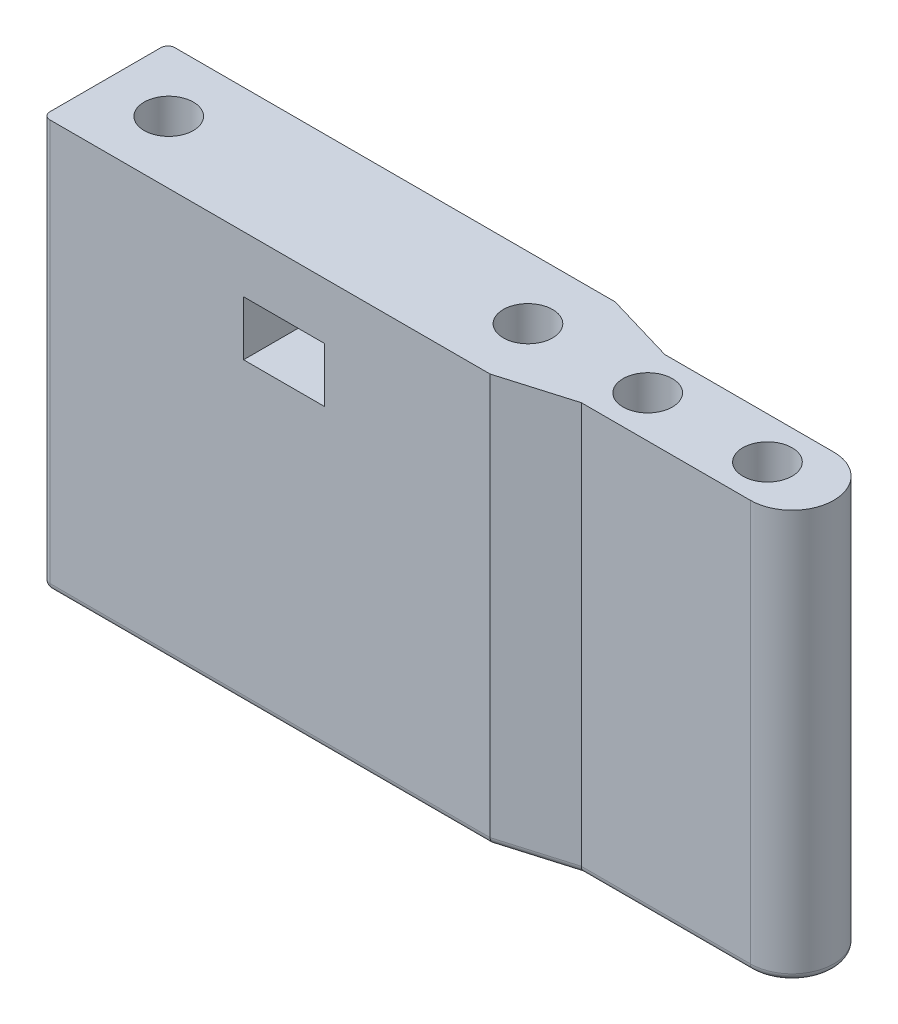
ISO-10303-21;
HEADER;
FILE_DESCRIPTION(('STEP AP214'),'2;1');
FILE_NAME('part.step','',(''),(''),'','','');
FILE_SCHEMA(('AUTOMOTIVE_DESIGN { 1 0 10303 214 1 1 1 1 }'));
ENDSEC;
DATA;
#1=APPLICATION_CONTEXT('core data for automotive mechanical design processes');
#2=APPLICATION_PROTOCOL_DEFINITION('international standard','automotive_design',2000,#1);
#3=PRODUCT_CONTEXT('',#1,'mechanical');
#4=PRODUCT('Part','Part','',(#3));
#5=PRODUCT_RELATED_PRODUCT_CATEGORY('part','',(#4));
#6=PRODUCT_DEFINITION_FORMATION('','',#4);
#7=PRODUCT_DEFINITION_CONTEXT('part definition',#1,'design');
#8=PRODUCT_DEFINITION('design','',#6,#7);
#9=PRODUCT_DEFINITION_SHAPE('','',#8);
#10=(LENGTH_UNIT() NAMED_UNIT(*) SI_UNIT(.MILLI.,.METRE.));
#11=(NAMED_UNIT(*) PLANE_ANGLE_UNIT() SI_UNIT($,.RADIAN.));
#12=(NAMED_UNIT(*) SI_UNIT($,.STERADIAN.) SOLID_ANGLE_UNIT());
#13=UNCERTAINTY_MEASURE_WITH_UNIT(LENGTH_MEASURE(1.E-05),#10,'distance_accuracy_value','');
#14=(GEOMETRIC_REPRESENTATION_CONTEXT(3) GLOBAL_UNCERTAINTY_ASSIGNED_CONTEXT((#13)) GLOBAL_UNIT_ASSIGNED_CONTEXT((#10,
#11,#12)) REPRESENTATION_CONTEXT('',''));
#15=CARTESIAN_POINT('',(0.,0.,0.));
#16=DIRECTION('',(0.,0.,1.));
#17=DIRECTION('',(1.,0.,0.));
#18=AXIS2_PLACEMENT_3D('',#15,#16,#17);
#19=CARTESIAN_POINT('',(0.,0.,17.75));
#20=DIRECTION('',(0.,0.,1.));
#21=DIRECTION('',(1.,0.,0.));
#22=AXIS2_PLACEMENT_3D('',#19,#20,#21);
#23=PLANE('',#22);
#24=DIRECTION('',(-1.,0.,0.));
#25=VECTOR('',#24,1.);
#26=CARTESIAN_POINT('',(-87.4648511856686,42.1547619047619,17.75));
#27=LINE('',#26,#25);
#28=CARTESIAN_POINT('',(-23.9648511856685,42.1547619047619,17.75));
#29=VERTEX_POINT('',#28);
#30=CARTESIAN_POINT('',(-86.4648511856686,42.1547619047619,17.75));
#31=VERTEX_POINT('',#30);
#32=EDGE_CURVE('E181',#29,#31,#27,.T.);
#33=ORIENTED_EDGE('',*,*,#32,.T.);
#34=DIRECTION('',(0.,-1.,0.));
#35=VECTOR('',#34,1.);
#36=CARTESIAN_POINT('',(-86.4648511856686,-14.8452380952381,17.75));
#37=LINE('',#36,#35);
#38=CARTESIAN_POINT('',(-86.4648511856686,-14.8452380952381,17.75));
#39=VERTEX_POINT('',#38);
#40=EDGE_CURVE('E262',#31,#39,#37,.T.);
#41=ORIENTED_EDGE('',*,*,#40,.T.);
#42=DIRECTION('',(1.,0.,0.));
#43=VECTOR('',#42,1.);
#44=CARTESIAN_POINT('',(-23.9648511856685,-14.8452380952381,17.75));
#45=LINE('',#44,#43);
#46=CARTESIAN_POINT('',(-23.9648511856685,-14.8452380952381,17.75));
#47=VERTEX_POINT('',#46);
#48=EDGE_CURVE('E184',#39,#47,#45,.T.);
#49=ORIENTED_EDGE('',*,*,#48,.T.);
#50=DIRECTION('',(0.,-1.,0.));
#51=VECTOR('',#50,1.);
#52=CARTESIAN_POINT('',(-23.9648511856685,42.1547619047619,17.75));
#53=LINE('',#52,#51);
#54=EDGE_CURVE('E169',#29,#47,#53,.T.);
#55=ORIENTED_EDGE('',*,*,#54,.F.);
#56=EDGE_LOOP('',(#33,#41,#49,#55));
#57=FACE_BOUND('',#56,.T.);
#58=DIRECTION('',(1.,0.,0.));
#59=VECTOR('',#58,1.);
#60=CARTESIAN_POINT('',(-58.9648511856686,26.4047619047619,17.75));
#61=LINE('',#60,#59);
#62=CARTESIAN_POINT('',(-58.9648511856686,26.4047619047619,17.75));
#63=VERTEX_POINT('',#62);
#64=CARTESIAN_POINT('',(-47.4648511856686,26.4047619047619,17.75));
#65=VERTEX_POINT('',#64);
#66=EDGE_CURVE('E336',#63,#65,#61,.T.);
#67=ORIENTED_EDGE('',*,*,#66,.F.);
#68=DIRECTION('',(0.,-1.,0.));
#69=VECTOR('',#68,1.);
#70=CARTESIAN_POINT('',(-58.9648511856686,34.1547619047619,17.75));
#71=LINE('',#70,#69);
#72=CARTESIAN_POINT('',(-58.9648511856686,34.1547619047619,17.75));
#73=VERTEX_POINT('',#72);
#74=EDGE_CURVE('E334',#73,#63,#71,.T.);
#75=ORIENTED_EDGE('',*,*,#74,.F.);
#76=DIRECTION('',(-1.,0.,0.));
#77=VECTOR('',#76,1.);
#78=CARTESIAN_POINT('',(-58.9648511856686,34.1547619047619,17.75));
#79=LINE('',#78,#77);
#80=CARTESIAN_POINT('',(-47.4648511856686,34.1547619047619,17.75));
#81=VERTEX_POINT('',#80);
#82=EDGE_CURVE('E342',#81,#73,#79,.T.);
#83=ORIENTED_EDGE('',*,*,#82,.F.);
#84=DIRECTION('',(0.,1.,0.));
#85=VECTOR('',#84,1.);
#86=CARTESIAN_POINT('',(-47.4648511856686,34.1547619047619,17.75));
#87=LINE('',#86,#85);
#88=EDGE_CURVE('E339',#65,#81,#87,.T.);
#89=ORIENTED_EDGE('',*,*,#88,.F.);
#90=EDGE_LOOP('',(#67,#75,#83,#89));
#91=FACE_BOUND('',#90,.T.);
#92=ADVANCED_FACE('F37',(#57,#91),#23,.T.);
#93=CARTESIAN_POINT('',(0.,0.,0.));
#94=DIRECTION('',(0.,0.,1.));
#95=DIRECTION('',(1.,0.,0.));
#96=AXIS2_PLACEMENT_3D('',#93,#94,#95);
#97=PLANE('',#96);
#98=DIRECTION('',(1.,0.,0.));
#99=VECTOR('',#98,1.);
#100=CARTESIAN_POINT('',(0.,-14.8452380952381,0.));
#101=LINE('',#100,#99);
#102=CARTESIAN_POINT('',(-23.9648511856685,-14.8452380952381,0.));
#103=VERTEX_POINT('',#102);
#104=CARTESIAN_POINT('',(-86.4648511856686,-14.8452380952381,0.));
#105=VERTEX_POINT('',#104);
#106=EDGE_CURVE('E230',#103,#105,#101,.F.);
#107=ORIENTED_EDGE('',*,*,#106,.T.);
#108=DIRECTION('',(0.,-1.,0.));
#109=VECTOR('',#108,1.);
#110=CARTESIAN_POINT('',(-86.4648511856686,0.,0.));
#111=LINE('',#110,#109);
#112=CARTESIAN_POINT('',(-86.4648511856686,42.1547619047619,0.));
#113=VERTEX_POINT('',#112);
#114=EDGE_CURVE('E11',#105,#113,#111,.F.);
#115=ORIENTED_EDGE('',*,*,#114,.T.);
#116=DIRECTION('',(-1.,0.,0.));
#117=VECTOR('',#116,1.);
#118=CARTESIAN_POINT('',(-87.4648511856686,42.1547619047619,0.));
#119=LINE('',#118,#117);
#120=CARTESIAN_POINT('',(-23.9648511856685,42.1547619047619,0.));
#121=VERTEX_POINT('',#120);
#122=EDGE_CURVE('E190',#121,#113,#119,.T.);
#123=ORIENTED_EDGE('',*,*,#122,.F.);
#124=DIRECTION('',(0.,-1.,0.));
#125=VECTOR('',#124,1.);
#126=CARTESIAN_POINT('',(-23.9648511856685,42.1547619047619,0.));
#127=LINE('',#126,#125);
#128=EDGE_CURVE('E329',#121,#103,#127,.T.);
#129=ORIENTED_EDGE('',*,*,#128,.T.);
#130=EDGE_LOOP('',(#107,#115,#123,#129));
#131=FACE_BOUND('',#130,.T.);
#132=DIRECTION('',(0.,-1.,0.));
#133=VECTOR('',#132,1.);
#134=CARTESIAN_POINT('',(-58.9648511856686,34.1547619047619,0.));
#135=LINE('',#134,#133);
#136=CARTESIAN_POINT('',(-58.9648511856686,34.1547619047619,0.));
#137=VERTEX_POINT('',#136);
#138=CARTESIAN_POINT('',(-58.9648511856686,26.4047619047619,0.));
#139=VERTEX_POINT('',#138);
#140=EDGE_CURVE('E345',#137,#139,#135,.T.);
#141=ORIENTED_EDGE('',*,*,#140,.T.);
#142=DIRECTION('',(1.,0.,0.));
#143=VECTOR('',#142,1.);
#144=CARTESIAN_POINT('',(-58.9648511856686,26.4047619047619,0.));
#145=LINE('',#144,#143);
#146=CARTESIAN_POINT('',(-47.4648511856686,26.4047619047619,0.));
#147=VERTEX_POINT('',#146);
#148=EDGE_CURVE('E348',#139,#147,#145,.T.);
#149=ORIENTED_EDGE('',*,*,#148,.T.);
#150=DIRECTION('',(0.,1.,0.));
#151=VECTOR('',#150,1.);
#152=CARTESIAN_POINT('',(-47.4648511856686,34.1547619047619,0.));
#153=LINE('',#152,#151);
#154=CARTESIAN_POINT('',(-47.4648511856686,34.1547619047619,0.));
#155=VERTEX_POINT('',#154);
#156=EDGE_CURVE('E351',#147,#155,#153,.T.);
#157=ORIENTED_EDGE('',*,*,#156,.T.);
#158=DIRECTION('',(-1.,0.,0.));
#159=VECTOR('',#158,1.);
#160=CARTESIAN_POINT('',(-58.9648511856686,34.1547619047619,0.));
#161=LINE('',#160,#159);
#162=EDGE_CURVE('E337',#155,#137,#161,.T.);
#163=ORIENTED_EDGE('',*,*,#162,.T.);
#164=EDGE_LOOP('',(#141,#149,#157,#163));
#165=FACE_BOUND('',#164,.T.);
#166=ADVANCED_FACE('F371',(#131,#165),#97,.F.);
#167=CARTESIAN_POINT('',(-87.4648511856686,42.1547619047619,17.75));
#168=DIRECTION('',(1.,0.,0.));
#169=DIRECTION('',(0.,0.,-1.));
#170=AXIS2_PLACEMENT_3D('',#167,#168,#169);
#171=PLANE('',#170);
#172=DIRECTION('',(0.,0.,-1.));
#173=VECTOR('',#172,1.);
#174=CARTESIAN_POINT('',(-87.4648511856686,-14.8452380952381,17.75));
#175=LINE('',#174,#173);
#176=CARTESIAN_POINT('',(-87.4648511856686,-14.8452380952381,1.));
#177=VERTEX_POINT('',#176);
#178=CARTESIAN_POINT('',(-87.4648511856686,-14.8452380952381,16.75));
#179=VERTEX_POINT('',#178);
#180=EDGE_CURVE('E216',#177,#179,#175,.F.);
#181=ORIENTED_EDGE('',*,*,#180,.T.);
#182=DIRECTION('',(0.,-1.,0.));
#183=VECTOR('',#182,1.);
#184=CARTESIAN_POINT('',(-87.4648511856686,42.1547619047619,16.75));
#185=LINE('',#184,#183);
#186=CARTESIAN_POINT('',(-87.4648511856686,42.1547619047619,16.75));
#187=VERTEX_POINT('',#186);
#188=EDGE_CURVE('E266',#179,#187,#185,.F.);
#189=ORIENTED_EDGE('',*,*,#188,.T.);
#190=DIRECTION('',(0.,0.,-1.));
#191=VECTOR('',#190,1.);
#192=CARTESIAN_POINT('',(-87.4648511856686,42.1547619047619,17.75));
#193=LINE('',#192,#191);
#194=CARTESIAN_POINT('',(-87.4648511856686,42.1547619047619,1.));
#195=VERTEX_POINT('',#194);
#196=EDGE_CURVE('E189',#187,#195,#193,.T.);
#197=ORIENTED_EDGE('',*,*,#196,.T.);
#198=DIRECTION('',(0.,-1.,0.));
#199=VECTOR('',#198,1.);
#200=CARTESIAN_POINT('',(-87.4648511856686,42.1547619047619,1.));
#201=LINE('',#200,#199);
#202=EDGE_CURVE('E264',#195,#177,#201,.T.);
#203=ORIENTED_EDGE('',*,*,#202,.T.);
#204=EDGE_LOOP('',(#181,#189,#197,#203));
#205=FACE_BOUND('',#204,.T.);
#206=ADVANCED_FACE('F283',(#205),#171,.F.);
#207=CARTESIAN_POINT('',(-87.4648511856686,-15.8452380952381,17.75));
#208=DIRECTION('',(0.,1.,0.));
#209=DIRECTION('',(0.,0.,1.));
#210=AXIS2_PLACEMENT_3D('',#207,#208,#209);
#211=PLANE('',#210);
#212=DIRECTION('',(1.,0.,0.));
#213=VECTOR('',#212,1.);
#214=CARTESIAN_POINT('',(-87.4648511856686,-15.8452380952381,16.75));
#215=LINE('',#214,#213);
#216=CARTESIAN_POINT('',(-24.1092746120698,-15.8452380952381,16.75));
#217=VERTEX_POINT('',#216);
#218=CARTESIAN_POINT('',(-86.4648511856686,-15.8452380952381,16.75));
#219=VERTEX_POINT('',#218);
#220=EDGE_CURVE('E210',#217,#219,#215,.F.);
#221=ORIENTED_EDGE('',*,*,#220,.T.);
#222=DIRECTION('',(0.,0.,-1.));
#223=VECTOR('',#222,1.);
#224=CARTESIAN_POINT('',(-86.4648511856686,-15.8452380952381,17.75));
#225=LINE('',#224,#223);
#226=CARTESIAN_POINT('',(-86.4648511856686,-15.8452380952381,1.));
#227=VERTEX_POINT('',#226);
#228=EDGE_CURVE('E213',#219,#227,#225,.T.);
#229=ORIENTED_EDGE('',*,*,#228,.T.);
#230=DIRECTION('',(1.,0.,0.));
#231=VECTOR('',#230,1.);
#232=CARTESIAN_POINT('',(-87.4648511856686,-15.8452380952381,1.));
#233=LINE('',#232,#231);
#234=CARTESIAN_POINT('',(-24.1092746120697,-15.8452380952381,1.));
#235=VERTEX_POINT('',#234);
#236=EDGE_CURVE('E192',#227,#235,#233,.T.);
#237=ORIENTED_EDGE('',*,*,#236,.T.);
#238=DIRECTION('',(-0.959136092351471,0.,-0.282945147243684));
#239=VECTOR('',#238,1.);
#240=CARTESIAN_POINT('',(-77.8470695786977,-15.8452380952381,-14.8526495151553));
#241=LINE('',#240,#239);
#242=CARTESIAN_POINT('',(-14.1092746120698,-15.8452380952381,3.95));
#243=VERTEX_POINT('',#242);
#244=EDGE_CURVE('E200',#235,#243,#241,.F.);
#245=ORIENTED_EDGE('',*,*,#244,.T.);
#246=DIRECTION('',(-1.,0.,0.));
#247=VECTOR('',#246,1.);
#248=CARTESIAN_POINT('',(-87.4648511856685,-15.8452380952381,3.94999999999994));
#249=LINE('',#248,#247);
#250=CARTESIAN_POINT('',(10.0351488143315,-15.8452380952381,3.95000000000001));
#251=VERTEX_POINT('',#250);
#252=EDGE_CURVE('E202',#243,#251,#249,.F.);
#253=ORIENTED_EDGE('',*,*,#252,.T.);
#254=CARTESIAN_POINT('',(10.0351488143315,-15.8452380952381,8.875));
#255=DIRECTION('',(0.,1.,0.));
#256=DIRECTION('',(0.,0.,1.));
#257=AXIS2_PLACEMENT_3D('',#254,#255,#256);
#258=CIRCLE('',#257,4.92499999999999);
#259=CARTESIAN_POINT('',(10.0351488143315,-15.8452380952381,13.8));
#260=VERTEX_POINT('',#259);
#261=EDGE_CURVE('E204',#251,#260,#258,.F.);
#262=ORIENTED_EDGE('',*,*,#261,.T.);
#263=DIRECTION('',(1.,0.,0.));
#264=VECTOR('',#263,1.);
#265=CARTESIAN_POINT('',(-87.4648511856686,-15.8452380952381,13.8));
#266=LINE('',#265,#264);
#267=CARTESIAN_POINT('',(-14.1092746120698,-15.8452380952381,13.8));
#268=VERTEX_POINT('',#267);
#269=EDGE_CURVE('E206',#260,#268,#266,.F.);
#270=ORIENTED_EDGE('',*,*,#269,.T.);
#271=DIRECTION('',(0.959136092351471,0.,-0.282945147243684));
#272=VECTOR('',#271,1.);
#273=CARTESIAN_POINT('',(-82.6641161047666,-15.8452380952381,34.0236782403456));
#274=LINE('',#273,#272);
#275=EDGE_CURVE('E208',#268,#217,#274,.F.);
#276=ORIENTED_EDGE('',*,*,#275,.T.);
#277=EDGE_LOOP('',(#221,#229,#237,#245,#253,#262,#270,#276));
#278=FACE_BOUND('',#277,.T.);
#279=ADVANCED_FACE('F399',(#278),#211,.F.);
#280=CARTESIAN_POINT('',(-87.4648511856686,42.1547619047619,17.75));
#281=DIRECTION('',(0.,-1.,0.));
#282=DIRECTION('',(1.,0.,0.));
#283=AXIS2_PLACEMENT_3D('',#280,#281,#282);
#284=PLANE('',#283);
#285=CARTESIAN_POINT('',(-78.4648511856686,42.1547619047619,8.87500000000001));
#286=DIRECTION('',(0.,1.,0.));
#287=DIRECTION('',(-1.,0.,0.));
#288=AXIS2_PLACEMENT_3D('',#285,#286,#287);
#289=CIRCLE('',#288,3.50000000000001);
#290=CARTESIAN_POINT('',(-81.9648511856686,42.1547619047619,8.87500000000001));
#291=VERTEX_POINT('',#290);
#292=EDGE_CURVE('E713',#291,#291,#289,.T.);
#293=ORIENTED_EDGE('',*,*,#292,.F.);
#294=EDGE_LOOP('',(#293));
#295=FACE_BOUND('',#294,.T.);
#296=CARTESIAN_POINT('',(-27.4648511856686,42.1547619047619,8.87500000000001));
#297=DIRECTION('',(0.,1.,0.));
#298=DIRECTION('',(-1.,0.,0.));
#299=AXIS2_PLACEMENT_3D('',#296,#297,#298);
#300=CIRCLE('',#299,3.50000000000001);
#301=CARTESIAN_POINT('',(-30.9648511856686,42.1547619047619,8.87500000000001));
#302=VERTEX_POINT('',#301);
#303=EDGE_CURVE('E707',#302,#302,#300,.T.);
#304=ORIENTED_EDGE('',*,*,#303,.F.);
#305=EDGE_LOOP('',(#304));
#306=FACE_BOUND('',#305,.T.);
#307=CARTESIAN_POINT('',(-10.4648511856686,42.1547619047619,8.87500000000001));
#308=DIRECTION('',(0.,1.,0.));
#309=DIRECTION('',(-1.,0.,0.));
#310=AXIS2_PLACEMENT_3D('',#307,#308,#309);
#311=CIRCLE('',#310,3.50000000000001);
#312=CARTESIAN_POINT('',(-13.9648511856686,42.1547619047619,8.87500000000001));
#313=VERTEX_POINT('',#312);
#314=EDGE_CURVE('E701',#313,#313,#311,.T.);
#315=ORIENTED_EDGE('',*,*,#314,.F.);
#316=EDGE_LOOP('',(#315));
#317=FACE_BOUND('',#316,.T.);
#318=CARTESIAN_POINT('',(6.53514881433145,42.1547619047619,8.87500000000001));
#319=DIRECTION('',(0.,1.,0.));
#320=DIRECTION('',(-1.,0.,0.));
#321=AXIS2_PLACEMENT_3D('',#318,#319,#320);
#322=CIRCLE('',#321,3.50000000000001);
#323=CARTESIAN_POINT('',(3.03514881433144,42.1547619047619,8.87500000000001));
#324=VERTEX_POINT('',#323);
#325=EDGE_CURVE('E252',#324,#324,#322,.T.);
#326=ORIENTED_EDGE('',*,*,#325,.F.);
#327=EDGE_LOOP('',(#326));
#328=FACE_BOUND('',#327,.T.);
#329=ORIENTED_EDGE('',*,*,#196,.F.);
#330=CARTESIAN_POINT('',(-86.4648511856686,42.1547619047619,16.75));
#331=DIRECTION('',(0.,-1.,0.));
#332=DIRECTION('',(1.,0.,0.));
#333=AXIS2_PLACEMENT_3D('',#330,#331,#332);
#334=CIRCLE('',#333,1.);
#335=EDGE_CURVE('E46',#187,#31,#334,.F.);
#336=ORIENTED_EDGE('',*,*,#335,.T.);
#337=ORIENTED_EDGE('',*,*,#32,.F.);
#338=DIRECTION('',(0.959136092351471,0.,-0.282945147243684));
#339=VECTOR('',#338,1.);
#340=CARTESIAN_POINT('',(-23.9648511856685,42.1547619047619,17.75));
#341=LINE('',#340,#339);
#342=CARTESIAN_POINT('',(-13.9648511856685,42.1547619047619,14.8));
#343=VERTEX_POINT('',#342);
#344=EDGE_CURVE('E166',#29,#343,#341,.T.);
#345=ORIENTED_EDGE('',*,*,#344,.T.);
#346=DIRECTION('',(1.,0.,0.));
#347=VECTOR('',#346,1.);
#348=CARTESIAN_POINT('',(-13.9648511856685,42.1547619047619,14.8));
#349=LINE('',#348,#347);
#350=CARTESIAN_POINT('',(10.0351488143315,42.1547619047619,14.8));
#351=VERTEX_POINT('',#350);
#352=EDGE_CURVE('E175',#343,#351,#349,.T.);
#353=ORIENTED_EDGE('',*,*,#352,.T.);
#354=CARTESIAN_POINT('',(10.0351488143315,42.1547619047619,8.875));
#355=DIRECTION('',(0.,1.,0.));
#356=DIRECTION('',(0.,0.,-1.));
#357=AXIS2_PLACEMENT_3D('',#354,#355,#356);
#358=CIRCLE('',#357,5.92499999999999);
#359=CARTESIAN_POINT('',(10.0351488143315,42.1547619047619,2.95000000000001));
#360=VERTEX_POINT('',#359);
#361=EDGE_CURVE('E693',#351,#360,#358,.T.);
#362=ORIENTED_EDGE('',*,*,#361,.T.);
#363=DIRECTION('',(-1.,0.,0.));
#364=VECTOR('',#363,1.);
#365=CARTESIAN_POINT('',(10.0351488143315,42.1547619047619,2.95000000000001));
#366=LINE('',#365,#364);
#367=CARTESIAN_POINT('',(-13.9648511856685,42.1547619047619,2.95));
#368=VERTEX_POINT('',#367);
#369=EDGE_CURVE('E325',#360,#368,#366,.T.);
#370=ORIENTED_EDGE('',*,*,#369,.T.);
#371=DIRECTION('',(-0.959136092351471,0.,-0.282945147243684));
#372=VECTOR('',#371,1.);
#373=CARTESIAN_POINT('',(-23.9648511856685,42.1547619047619,0.));
#374=LINE('',#373,#372);
#375=EDGE_CURVE('E185',#368,#121,#374,.T.);
#376=ORIENTED_EDGE('',*,*,#375,.T.);
#377=ORIENTED_EDGE('',*,*,#122,.T.);
#378=CARTESIAN_POINT('',(-86.4648511856686,42.1547619047619,1.));
#379=DIRECTION('',(0.,-1.,0.));
#380=DIRECTION('',(1.,0.,0.));
#381=AXIS2_PLACEMENT_3D('',#378,#379,#380);
#382=CIRCLE('',#381,1.);
#383=EDGE_CURVE('E59',#113,#195,#382,.F.);
#384=ORIENTED_EDGE('',*,*,#383,.T.);
#385=EDGE_LOOP('',(#329,#336,#337,#345,#353,#362,#370,#376,#377,#384));
#386=FACE_BOUND('',#385,.T.);
#387=ADVANCED_FACE('F187',(#295,#306,#317,#328,#386),#284,.F.);
#388=CARTESIAN_POINT('',(-58.9648511856686,34.1547619047619,17.75));
#389=DIRECTION('',(1.,0.,0.));
#390=DIRECTION('',(0.,1.,0.));
#391=AXIS2_PLACEMENT_3D('',#388,#389,#390);
#392=PLANE('',#391);
#393=ORIENTED_EDGE('',*,*,#140,.F.);
#394=DIRECTION('',(0.,0.,-1.));
#395=VECTOR('',#394,1.);
#396=CARTESIAN_POINT('',(-58.9648511856686,34.1547619047619,17.75));
#397=LINE('',#396,#395);
#398=EDGE_CURVE('E344',#73,#137,#397,.T.);
#399=ORIENTED_EDGE('',*,*,#398,.F.);
#400=ORIENTED_EDGE('',*,*,#74,.T.);
#401=DIRECTION('',(0.,0.,-1.));
#402=VECTOR('',#401,1.);
#403=CARTESIAN_POINT('',(-58.9648511856686,26.4047619047619,17.75));
#404=LINE('',#403,#402);
#405=EDGE_CURVE('E194',#63,#139,#404,.T.);
#406=ORIENTED_EDGE('',*,*,#405,.T.);
#407=EDGE_LOOP('',(#393,#399,#400,#406));
#408=FACE_BOUND('',#407,.T.);
#409=ADVANCED_FACE('F366',(#408),#392,.T.);
#410=CARTESIAN_POINT('',(-58.9648511856686,26.4047619047619,17.75));
#411=DIRECTION('',(0.,1.,0.));
#412=DIRECTION('',(0.,0.,1.));
#413=AXIS2_PLACEMENT_3D('',#410,#411,#412);
#414=PLANE('',#413);
#415=ORIENTED_EDGE('',*,*,#148,.F.);
#416=ORIENTED_EDGE('',*,*,#405,.F.);
#417=ORIENTED_EDGE('',*,*,#66,.T.);
#418=DIRECTION('',(0.,0.,-1.));
#419=VECTOR('',#418,1.);
#420=CARTESIAN_POINT('',(-47.4648511856686,26.4047619047619,17.75));
#421=LINE('',#420,#419);
#422=EDGE_CURVE('E359',#65,#147,#421,.T.);
#423=ORIENTED_EDGE('',*,*,#422,.T.);
#424=EDGE_LOOP('',(#415,#416,#417,#423));
#425=FACE_BOUND('',#424,.T.);
#426=ADVANCED_FACE('F377',(#425),#414,.T.);
#427=CARTESIAN_POINT('',(-47.4648511856686,34.1547619047619,17.75));
#428=DIRECTION('',(-1.,0.,0.));
#429=DIRECTION('',(0.,0.,1.));
#430=AXIS2_PLACEMENT_3D('',#427,#428,#429);
#431=PLANE('',#430);
#432=ORIENTED_EDGE('',*,*,#156,.F.);
#433=ORIENTED_EDGE('',*,*,#422,.F.);
#434=ORIENTED_EDGE('',*,*,#88,.T.);
#435=DIRECTION('',(0.,0.,-1.));
#436=VECTOR('',#435,1.);
#437=CARTESIAN_POINT('',(-47.4648511856686,34.1547619047619,17.75));
#438=LINE('',#437,#436);
#439=EDGE_CURVE('E358',#81,#155,#438,.T.);
#440=ORIENTED_EDGE('',*,*,#439,.T.);
#441=EDGE_LOOP('',(#432,#433,#434,#440));
#442=FACE_BOUND('',#441,.T.);
#443=ADVANCED_FACE('F379',(#442),#431,.T.);
#444=CARTESIAN_POINT('',(-58.9648511856686,34.1547619047619,17.75));
#445=DIRECTION('',(0.,-1.,0.));
#446=DIRECTION('',(0.,0.,-1.));
#447=AXIS2_PLACEMENT_3D('',#444,#445,#446);
#448=PLANE('',#447);
#449=ORIENTED_EDGE('',*,*,#162,.F.);
#450=ORIENTED_EDGE('',*,*,#439,.F.);
#451=ORIENTED_EDGE('',*,*,#82,.T.);
#452=ORIENTED_EDGE('',*,*,#398,.T.);
#453=EDGE_LOOP('',(#449,#450,#451,#452));
#454=FACE_BOUND('',#453,.T.);
#455=ADVANCED_FACE('F374',(#454),#448,.T.);
#456=CARTESIAN_POINT('',(-23.9648511856685,42.1547619047619,0.));
#457=DIRECTION('',(-0.282945147243684,0.,0.959136092351471));
#458=DIRECTION('',(0.959136092351471,0.,0.282945147243684));
#459=AXIS2_PLACEMENT_3D('',#456,#457,#458);
#460=PLANE('',#459);
#461=DIRECTION('',(0.,-1.,0.));
#462=VECTOR('',#461,1.);
#463=CARTESIAN_POINT('',(-13.9648511856685,42.1547619047619,2.95));
#464=LINE('',#463,#462);
#465=CARTESIAN_POINT('',(-13.9648511856685,-14.8452380952381,2.95));
#466=VERTEX_POINT('',#465);
#467=EDGE_CURVE('E327',#368,#466,#464,.T.);
#468=ORIENTED_EDGE('',*,*,#467,.T.);
#469=DIRECTION('',(-0.959136092351471,0.,-0.282945147243684));
#470=VECTOR('',#469,1.);
#471=CARTESIAN_POINT('',(-23.9648511856685,-14.8452380952381,0.));
#472=LINE('',#471,#470);
#473=EDGE_CURVE('E228',#466,#103,#472,.T.);
#474=ORIENTED_EDGE('',*,*,#473,.T.);
#475=ORIENTED_EDGE('',*,*,#128,.F.);
#476=ORIENTED_EDGE('',*,*,#375,.F.);
#477=EDGE_LOOP('',(#468,#474,#475,#476));
#478=FACE_BOUND('',#477,.T.);
#479=ADVANCED_FACE('F386',(#478),#460,.F.);
#480=CARTESIAN_POINT('',(10.0351488143315,42.1547619047619,2.95000000000001));
#481=DIRECTION('',(0.,0.,1.));
#482=DIRECTION('',(1.,0.,0.));
#483=AXIS2_PLACEMENT_3D('',#480,#481,#482);
#484=PLANE('',#483);
#485=DIRECTION('',(0.,-1.,0.));
#486=VECTOR('',#485,1.);
#487=CARTESIAN_POINT('',(10.0351488143315,42.1547619047619,2.95000000000001));
#488=LINE('',#487,#486);
#489=CARTESIAN_POINT('',(10.0351488143315,-14.8452380952381,2.95000000000001));
#490=VERTEX_POINT('',#489);
#491=EDGE_CURVE('E319',#360,#490,#488,.T.);
#492=ORIENTED_EDGE('',*,*,#491,.T.);
#493=DIRECTION('',(-1.,0.,0.));
#494=VECTOR('',#493,1.);
#495=CARTESIAN_POINT('',(10.0351488143315,-14.8452380952381,2.95000000000001));
#496=LINE('',#495,#494);
#497=EDGE_CURVE('E226',#490,#466,#496,.T.);
#498=ORIENTED_EDGE('',*,*,#497,.T.);
#499=ORIENTED_EDGE('',*,*,#467,.F.);
#500=ORIENTED_EDGE('',*,*,#369,.F.);
#501=EDGE_LOOP('',(#492,#498,#499,#500));
#502=FACE_BOUND('',#501,.T.);
#503=ADVANCED_FACE('F322',(#502),#484,.F.);
#504=CARTESIAN_POINT('',(10.0351488143315,42.1547619047619,8.875));
#505=DIRECTION('',(0.,-1.,0.));
#506=DIRECTION('',(0.,0.,-1.));
#507=AXIS2_PLACEMENT_3D('',#504,#505,#506);
#508=CYLINDRICAL_SURFACE('',#507,5.92499999999999);
#509=DIRECTION('',(0.,-1.,0.));
#510=VECTOR('',#509,1.);
#511=CARTESIAN_POINT('',(10.0351488143315,42.1547619047619,14.8));
#512=LINE('',#511,#510);
#513=CARTESIAN_POINT('',(10.0351488143315,-14.8452380952381,14.8));
#514=VERTEX_POINT('',#513);
#515=EDGE_CURVE('E303',#351,#514,#512,.T.);
#516=ORIENTED_EDGE('',*,*,#515,.T.);
#517=CARTESIAN_POINT('',(10.0351488143315,-14.8452380952381,8.875));
#518=DIRECTION('',(0.,1.,0.));
#519=DIRECTION('',(0.,0.,1.));
#520=AXIS2_PLACEMENT_3D('',#517,#518,#519);
#521=CIRCLE('',#520,5.92499999999999);
#522=EDGE_CURVE('E224',#514,#490,#521,.T.);
#523=ORIENTED_EDGE('',*,*,#522,.T.);
#524=ORIENTED_EDGE('',*,*,#491,.F.);
#525=ORIENTED_EDGE('',*,*,#361,.F.);
#526=EDGE_LOOP('',(#516,#523,#524,#525));
#527=FACE_BOUND('',#526,.T.);
#528=ADVANCED_FACE('F317',(#527),#508,.T.);
#529=CARTESIAN_POINT('',(-13.9648511856685,42.1547619047619,14.8));
#530=DIRECTION('',(0.,0.,-1.));
#531=DIRECTION('',(-1.,0.,0.));
#532=AXIS2_PLACEMENT_3D('',#529,#530,#531);
#533=PLANE('',#532);
#534=DIRECTION('',(0.,-1.,0.));
#535=VECTOR('',#534,1.);
#536=CARTESIAN_POINT('',(-13.9648511856685,42.1547619047619,14.8));
#537=LINE('',#536,#535);
#538=CARTESIAN_POINT('',(-13.9648511856685,-14.8452380952381,14.8));
#539=VERTEX_POINT('',#538);
#540=EDGE_CURVE('E172',#343,#539,#537,.T.);
#541=ORIENTED_EDGE('',*,*,#540,.T.);
#542=DIRECTION('',(1.,0.,0.));
#543=VECTOR('',#542,1.);
#544=CARTESIAN_POINT('',(-13.9648511856685,-14.8452380952381,14.8));
#545=LINE('',#544,#543);
#546=EDGE_CURVE('E222',#539,#514,#545,.T.);
#547=ORIENTED_EDGE('',*,*,#546,.T.);
#548=ORIENTED_EDGE('',*,*,#515,.F.);
#549=ORIENTED_EDGE('',*,*,#352,.F.);
#550=EDGE_LOOP('',(#541,#547,#548,#549));
#551=FACE_BOUND('',#550,.T.);
#552=ADVANCED_FACE('F301',(#551),#533,.F.);
#553=CARTESIAN_POINT('',(-23.9648511856685,42.1547619047619,17.75));
#554=DIRECTION('',(-0.282945147243684,0.,-0.959136092351471));
#555=DIRECTION('',(-0.959136092351471,0.,0.282945147243684));
#556=AXIS2_PLACEMENT_3D('',#553,#554,#555);
#557=PLANE('',#556);
#558=ORIENTED_EDGE('',*,*,#54,.T.);
#559=DIRECTION('',(0.959136092351471,0.,-0.282945147243684));
#560=VECTOR('',#559,1.);
#561=CARTESIAN_POINT('',(-23.9648511856685,-14.8452380952381,17.75));
#562=LINE('',#561,#560);
#563=EDGE_CURVE('E220',#47,#539,#562,.T.);
#564=ORIENTED_EDGE('',*,*,#563,.T.);
#565=ORIENTED_EDGE('',*,*,#540,.F.);
#566=ORIENTED_EDGE('',*,*,#344,.F.);
#567=EDGE_LOOP('',(#558,#564,#565,#566));
#568=FACE_BOUND('',#567,.T.);
#569=ADVANCED_FACE('F168',(#568),#557,.F.);
#570=CARTESIAN_POINT('',(6.53514881433145,32.1547619047619,8.87500000000001));
#571=DIRECTION('',(0.,1.,0.));
#572=DIRECTION('',(-1.,0.,0.));
#573=AXIS2_PLACEMENT_3D('',#570,#571,#572);
#574=CYLINDRICAL_SURFACE('',#573,3.50000000000001);
#575=CARTESIAN_POINT('',(6.53514881433145,32.1547619047619,8.87500000000001));
#576=DIRECTION('',(0.,1.,0.));
#577=DIRECTION('',(-1.,0.,0.));
#578=AXIS2_PLACEMENT_3D('',#575,#576,#577);
#579=CIRCLE('',#578,3.50000000000001);
#580=CARTESIAN_POINT('',(3.03514881433144,32.1547619047619,8.87500000000001));
#581=VERTEX_POINT('',#580);
#582=EDGE_CURVE('E698',#581,#581,#579,.T.);
#583=ORIENTED_EDGE('',*,*,#582,.F.);
#584=EDGE_LOOP('',(#583));
#585=FACE_BOUND('',#584,.T.);
#586=ORIENTED_EDGE('',*,*,#325,.T.);
#587=EDGE_LOOP('',(#586));
#588=FACE_BOUND('',#587,.T.);
#589=ADVANCED_FACE('F535',(#585,#588),#574,.F.);
#590=CARTESIAN_POINT('',(6.53514881433145,32.1547619047619,8.87500000000001));
#591=DIRECTION('',(0.,1.,0.));
#592=DIRECTION('',(-1.,0.,0.));
#593=AXIS2_PLACEMENT_3D('',#590,#591,#592);
#594=PLANE('',#593);
#595=ORIENTED_EDGE('',*,*,#582,.T.);
#596=EDGE_LOOP('',(#595));
#597=FACE_BOUND('',#596,.T.);
#598=ADVANCED_FACE('F527',(#597),#594,.T.);
#599=CARTESIAN_POINT('',(-10.4648511856686,32.1547619047619,8.87500000000001));
#600=DIRECTION('',(0.,1.,0.));
#601=DIRECTION('',(-1.,0.,0.));
#602=AXIS2_PLACEMENT_3D('',#599,#600,#601);
#603=CYLINDRICAL_SURFACE('',#602,3.50000000000001);
#604=CARTESIAN_POINT('',(-10.4648511856686,32.1547619047619,8.87500000000001));
#605=DIRECTION('',(0.,1.,0.));
#606=DIRECTION('',(-1.,0.,0.));
#607=AXIS2_PLACEMENT_3D('',#604,#605,#606);
#608=CIRCLE('',#607,3.50000000000001);
#609=CARTESIAN_POINT('',(-13.9648511856686,32.1547619047619,8.87500000000001));
#610=VERTEX_POINT('',#609);
#611=EDGE_CURVE('E704',#610,#610,#608,.T.);
#612=ORIENTED_EDGE('',*,*,#611,.F.);
#613=EDGE_LOOP('',(#612));
#614=FACE_BOUND('',#613,.T.);
#615=ORIENTED_EDGE('',*,*,#314,.T.);
#616=EDGE_LOOP('',(#615));
#617=FACE_BOUND('',#616,.T.);
#618=ADVANCED_FACE('F519',(#614,#617),#603,.F.);
#619=CARTESIAN_POINT('',(-10.4648511856686,32.1547619047619,8.87500000000001));
#620=DIRECTION('',(0.,1.,0.));
#621=DIRECTION('',(-1.,0.,0.));
#622=AXIS2_PLACEMENT_3D('',#619,#620,#621);
#623=PLANE('',#622);
#624=ORIENTED_EDGE('',*,*,#611,.T.);
#625=EDGE_LOOP('',(#624));
#626=FACE_BOUND('',#625,.T.);
#627=ADVANCED_FACE('F511',(#626),#623,.T.);
#628=CARTESIAN_POINT('',(-27.4648511856686,32.1547619047619,8.87500000000001));
#629=DIRECTION('',(0.,1.,0.));
#630=DIRECTION('',(-1.,0.,0.));
#631=AXIS2_PLACEMENT_3D('',#628,#629,#630);
#632=CYLINDRICAL_SURFACE('',#631,3.50000000000001);
#633=CARTESIAN_POINT('',(-27.4648511856686,32.1547619047619,8.87500000000001));
#634=DIRECTION('',(0.,1.,0.));
#635=DIRECTION('',(-1.,0.,0.));
#636=AXIS2_PLACEMENT_3D('',#633,#634,#635);
#637=CIRCLE('',#636,3.50000000000001);
#638=CARTESIAN_POINT('',(-30.9648511856686,32.1547619047619,8.87500000000001));
#639=VERTEX_POINT('',#638);
#640=EDGE_CURVE('E710',#639,#639,#637,.T.);
#641=ORIENTED_EDGE('',*,*,#640,.F.);
#642=EDGE_LOOP('',(#641));
#643=FACE_BOUND('',#642,.T.);
#644=ORIENTED_EDGE('',*,*,#303,.T.);
#645=EDGE_LOOP('',(#644));
#646=FACE_BOUND('',#645,.T.);
#647=ADVANCED_FACE('F503',(#643,#646),#632,.F.);
#648=CARTESIAN_POINT('',(-27.4648511856686,32.1547619047619,8.87500000000001));
#649=DIRECTION('',(0.,1.,0.));
#650=DIRECTION('',(-1.,0.,0.));
#651=AXIS2_PLACEMENT_3D('',#648,#649,#650);
#652=PLANE('',#651);
#653=ORIENTED_EDGE('',*,*,#640,.T.);
#654=EDGE_LOOP('',(#653));
#655=FACE_BOUND('',#654,.T.);
#656=ADVANCED_FACE('F495',(#655),#652,.T.);
#657=CARTESIAN_POINT('',(-78.4648511856686,32.1547619047619,8.87500000000001));
#658=DIRECTION('',(0.,1.,0.));
#659=DIRECTION('',(-1.,0.,0.));
#660=AXIS2_PLACEMENT_3D('',#657,#658,#659);
#661=CYLINDRICAL_SURFACE('',#660,3.50000000000001);
#662=CARTESIAN_POINT('',(-78.4648511856686,32.1547619047619,8.87500000000001));
#663=DIRECTION('',(0.,1.,0.));
#664=DIRECTION('',(-1.,0.,0.));
#665=AXIS2_PLACEMENT_3D('',#662,#663,#664);
#666=CIRCLE('',#665,3.50000000000001);
#667=CARTESIAN_POINT('',(-81.9648511856686,32.1547619047619,8.87500000000001));
#668=VERTEX_POINT('',#667);
#669=EDGE_CURVE('E176',#668,#668,#666,.T.);
#670=ORIENTED_EDGE('',*,*,#669,.F.);
#671=EDGE_LOOP('',(#670));
#672=FACE_BOUND('',#671,.T.);
#673=ORIENTED_EDGE('',*,*,#292,.T.);
#674=EDGE_LOOP('',(#673));
#675=FACE_BOUND('',#674,.T.);
#676=ADVANCED_FACE('F486',(#672,#675),#661,.F.);
#677=CARTESIAN_POINT('',(-78.4648511856686,32.1547619047619,8.87500000000001));
#678=DIRECTION('',(0.,1.,0.));
#679=DIRECTION('',(-1.,0.,0.));
#680=AXIS2_PLACEMENT_3D('',#677,#678,#679);
#681=PLANE('',#680);
#682=ORIENTED_EDGE('',*,*,#669,.T.);
#683=EDGE_LOOP('',(#682));
#684=FACE_BOUND('',#683,.T.);
#685=ADVANCED_FACE('F428',(#684),#681,.T.);
#686=CARTESIAN_POINT('',(10.0351488143315,-14.8452380952381,8.875));
#687=DIRECTION('',(0.,1.,0.));
#688=DIRECTION('',(0.,0.,1.));
#689=AXIS2_PLACEMENT_3D('',#686,#687,#688);
#690=TOROIDAL_SURFACE('',#689,4.92499999999999,1.);
#691=CARTESIAN_POINT('',(10.0351488143315,-14.8452380952381,3.95000000000001));
#692=DIRECTION('',(-1.,0.,0.));
#693=DIRECTION('',(0.,0.,1.));
#694=AXIS2_PLACEMENT_3D('',#691,#692,#693);
#695=CIRCLE('',#694,1.);
#696=EDGE_CURVE('E246',#490,#251,#695,.T.);
#697=ORIENTED_EDGE('',*,*,#696,.F.);
#698=ORIENTED_EDGE('',*,*,#522,.F.);
#699=CARTESIAN_POINT('',(10.0351488143315,-14.8452380952381,13.8));
#700=DIRECTION('',(-1.,0.,0.));
#701=DIRECTION('',(0.,0.,1.));
#702=AXIS2_PLACEMENT_3D('',#699,#700,#701);
#703=CIRCLE('',#702,1.);
#704=EDGE_CURVE('E249',#260,#514,#703,.T.);
#705=ORIENTED_EDGE('',*,*,#704,.F.);
#706=ORIENTED_EDGE('',*,*,#261,.F.);
#707=EDGE_LOOP('',(#697,#698,#705,#706));
#708=FACE_BOUND('',#707,.T.);
#709=ADVANCED_FACE('F313',(#708),#690,.T.);
#710=CARTESIAN_POINT('',(-13.9648511856685,-14.8452380952381,13.8));
#711=DIRECTION('',(1.,0.,0.));
#712=DIRECTION('',(0.,0.,-1.));
#713=AXIS2_PLACEMENT_3D('',#710,#711,#712);
#714=CYLINDRICAL_SURFACE('',#713,1.);
#715=ORIENTED_EDGE('',*,*,#704,.T.);
#716=ORIENTED_EDGE('',*,*,#546,.F.);
#717=CARTESIAN_POINT('',(-14.1092746120698,-14.8452380952381,13.8));
#718=DIRECTION('',(0.989731299987899,0.,-0.14294038556078));
#719=DIRECTION('',(-0.14294038556078,0.,-0.989731299987898));
#720=AXIS2_PLACEMENT_3D('',#717,#718,#719);
#721=ELLIPSE('',#720,1.0103752402417,1.);
#722=EDGE_CURVE('E243',#268,#539,#721,.F.);
#723=ORIENTED_EDGE('',*,*,#722,.F.);
#724=ORIENTED_EDGE('',*,*,#269,.F.);
#725=EDGE_LOOP('',(#715,#716,#723,#724));
#726=FACE_BOUND('',#725,.T.);
#727=ADVANCED_FACE('F306',(#726),#714,.T.);
#728=CARTESIAN_POINT('',(10.0351488143315,-14.8452380952381,3.95000000000001));
#729=DIRECTION('',(-1.,0.,0.));
#730=DIRECTION('',(0.,0.,1.));
#731=AXIS2_PLACEMENT_3D('',#728,#729,#730);
#732=CYLINDRICAL_SURFACE('',#731,1.);
#733=ORIENTED_EDGE('',*,*,#696,.T.);
#734=ORIENTED_EDGE('',*,*,#252,.F.);
#735=CARTESIAN_POINT('',(-14.1092746120696,-14.8452380952381,3.95000000000002));
#736=DIRECTION('',(-0.989731299987898,0.,-0.14294038556078));
#737=DIRECTION('',(-0.14294038556078,0.,0.989731299987899));
#738=AXIS2_PLACEMENT_3D('',#735,#736,#737);
#739=ELLIPSE('',#738,1.0103752402417,1.);
#740=EDGE_CURVE('E240',#466,#243,#739,.T.);
#741=ORIENTED_EDGE('',*,*,#740,.F.);
#742=ORIENTED_EDGE('',*,*,#497,.F.);
#743=EDGE_LOOP('',(#733,#734,#741,#742));
#744=FACE_BOUND('',#743,.T.);
#745=ADVANCED_FACE('F420',(#744),#732,.T.);
#746=CARTESIAN_POINT('',(-24.2477963329122,-14.8452380952381,16.7908639076485));
#747=DIRECTION('',(0.959136092351471,0.,-0.282945147243684));
#748=DIRECTION('',(-0.282945147243684,0.,-0.959136092351471));
#749=AXIS2_PLACEMENT_3D('',#746,#747,#748);
#750=CYLINDRICAL_SURFACE('',#749,1.);
#751=ORIENTED_EDGE('',*,*,#722,.T.);
#752=ORIENTED_EDGE('',*,*,#563,.F.);
#753=CARTESIAN_POINT('',(-24.1092746120698,-14.8452380952381,16.75));
#754=DIRECTION('',(0.989731299987899,0.,-0.14294038556078));
#755=DIRECTION('',(-0.14294038556078,0.,-0.989731299987899));
#756=AXIS2_PLACEMENT_3D('',#753,#754,#755);
#757=ELLIPSE('',#756,1.0103752402417,1.);
#758=EDGE_CURVE('E236',#217,#47,#757,.F.);
#759=ORIENTED_EDGE('',*,*,#758,.F.);
#760=ORIENTED_EDGE('',*,*,#275,.F.);
#761=EDGE_LOOP('',(#751,#752,#759,#760));
#762=FACE_BOUND('',#761,.T.);
#763=ADVANCED_FACE('F297',(#762),#750,.T.);
#764=CARTESIAN_POINT('',(-24.2477963329122,-14.8452380952381,0.959136092351466));
#765=DIRECTION('',(-0.959136092351471,0.,-0.282945147243684));
#766=DIRECTION('',(-0.282945147243684,0.,0.959136092351471));
#767=AXIS2_PLACEMENT_3D('',#764,#765,#766);
#768=CYLINDRICAL_SURFACE('',#767,1.);
#769=ORIENTED_EDGE('',*,*,#740,.T.);
#770=ORIENTED_EDGE('',*,*,#244,.F.);
#771=CARTESIAN_POINT('',(-24.1092746120699,-14.8452380952381,0.999999999999982));
#772=DIRECTION('',(0.989731299987899,0.,0.14294038556078));
#773=DIRECTION('',(0.142940385560779,0.,-0.989731299987899));
#774=AXIS2_PLACEMENT_3D('',#771,#772,#773);
#775=ELLIPSE('',#774,1.0103752402417,1.);
#776=EDGE_CURVE('E233',#103,#235,#775,.F.);
#777=ORIENTED_EDGE('',*,*,#776,.F.);
#778=ORIENTED_EDGE('',*,*,#473,.F.);
#779=EDGE_LOOP('',(#769,#770,#777,#778));
#780=FACE_BOUND('',#779,.T.);
#781=ADVANCED_FACE('F414',(#780),#768,.T.);
#782=CARTESIAN_POINT('',(0.,-14.8452380952381,16.75));
#783=DIRECTION('',(-1.,0.,0.));
#784=DIRECTION('',(0.,0.,1.));
#785=AXIS2_PLACEMENT_3D('',#782,#783,#784);
#786=CYLINDRICAL_SURFACE('',#785,1.);
#787=ORIENTED_EDGE('',*,*,#48,.F.);
#788=CARTESIAN_POINT('',(-86.4648511856686,-14.8452380952381,16.75));
#789=DIRECTION('',(-1.,0.,0.));
#790=DIRECTION('',(0.,0.,1.));
#791=AXIS2_PLACEMENT_3D('',#788,#789,#790);
#792=CIRCLE('',#791,1.);
#793=EDGE_CURVE('E258',#39,#219,#792,.F.);
#794=ORIENTED_EDGE('',*,*,#793,.T.);
#795=ORIENTED_EDGE('',*,*,#220,.F.);
#796=ORIENTED_EDGE('',*,*,#758,.T.);
#797=EDGE_LOOP('',(#787,#794,#795,#796));
#798=FACE_BOUND('',#797,.T.);
#799=ADVANCED_FACE('F293',(#798),#786,.T.);
#800=CARTESIAN_POINT('',(-87.4648511856686,-14.8452380952381,1.));
#801=DIRECTION('',(1.,0.,0.));
#802=DIRECTION('',(0.,0.,-1.));
#803=AXIS2_PLACEMENT_3D('',#800,#801,#802);
#804=CYLINDRICAL_SURFACE('',#803,1.);
#805=ORIENTED_EDGE('',*,*,#236,.F.);
#806=CARTESIAN_POINT('',(-86.4648511856686,-14.8452380952381,1.));
#807=DIRECTION('',(1.,0.,0.));
#808=DIRECTION('',(0.,0.,-1.));
#809=AXIS2_PLACEMENT_3D('',#806,#807,#808);
#810=CIRCLE('',#809,1.);
#811=EDGE_CURVE('E260',#227,#105,#810,.T.);
#812=ORIENTED_EDGE('',*,*,#811,.T.);
#813=ORIENTED_EDGE('',*,*,#106,.F.);
#814=ORIENTED_EDGE('',*,*,#776,.T.);
#815=EDGE_LOOP('',(#805,#812,#813,#814));
#816=FACE_BOUND('',#815,.T.);
#817=ADVANCED_FACE('F408',(#816),#804,.T.);
#818=CARTESIAN_POINT('',(-86.4648511856686,-14.8452380952381,17.75));
#819=DIRECTION('',(0.,0.,-1.));
#820=DIRECTION('',(-1.,0.,0.));
#821=AXIS2_PLACEMENT_3D('',#818,#819,#820);
#822=CYLINDRICAL_SURFACE('',#821,1.);
#823=ORIENTED_EDGE('',*,*,#228,.F.);
#824=CARTESIAN_POINT('',(-86.4648511856686,-14.8452380952381,16.75));
#825=DIRECTION('',(0.,0.,-1.));
#826=DIRECTION('',(-1.,0.,0.));
#827=AXIS2_PLACEMENT_3D('',#824,#825,#826);
#828=CIRCLE('',#827,1.);
#829=EDGE_CURVE('E255',#219,#179,#828,.T.);
#830=ORIENTED_EDGE('',*,*,#829,.T.);
#831=ORIENTED_EDGE('',*,*,#180,.F.);
#832=CARTESIAN_POINT('',(-86.4648511856686,-14.8452380952381,1.));
#833=DIRECTION('',(0.,0.,-1.));
#834=DIRECTION('',(-1.,0.,0.));
#835=AXIS2_PLACEMENT_3D('',#832,#833,#834);
#836=CIRCLE('',#835,1.);
#837=EDGE_CURVE('E232',#177,#227,#836,.F.);
#838=ORIENTED_EDGE('',*,*,#837,.T.);
#839=EDGE_LOOP('',(#823,#830,#831,#838));
#840=FACE_BOUND('',#839,.T.);
#841=ADVANCED_FACE('F286',(#840),#822,.T.);
#842=CARTESIAN_POINT('',(-86.4648511856686,0.,16.75));
#843=DIRECTION('',(0.,1.,0.));
#844=DIRECTION('',(0.,0.,1.));
#845=AXIS2_PLACEMENT_3D('',#842,#843,#844);
#846=CYLINDRICAL_SURFACE('',#845,1.);
#847=ORIENTED_EDGE('',*,*,#335,.F.);
#848=ORIENTED_EDGE('',*,*,#188,.F.);
#849=CARTESIAN_POINT('',(-86.4648511856686,-14.8452380952381,16.75));
#850=DIRECTION('',(0.,-1.,0.));
#851=DIRECTION('',(1.,0.,0.));
#852=AXIS2_PLACEMENT_3D('',#849,#850,#851);
#853=CIRCLE('',#852,1.);
#854=EDGE_CURVE('E237',#39,#179,#853,.T.);
#855=ORIENTED_EDGE('',*,*,#854,.F.);
#856=ORIENTED_EDGE('',*,*,#40,.F.);
#857=EDGE_LOOP('',(#847,#848,#855,#856));
#858=FACE_BOUND('',#857,.T.);
#859=ADVANCED_FACE('F292',(#858),#846,.T.);
#860=CARTESIAN_POINT('',(-86.4648511856686,-14.8452380952381,16.75));
#861=DIRECTION('',(0.,0.,1.));
#862=DIRECTION('',(1.,0.,0.));
#863=AXIS2_PLACEMENT_3D('',#860,#861,#862);
#864=SPHERICAL_SURFACE('',#863,1.);
#865=ORIENTED_EDGE('',*,*,#829,.F.);
#866=ORIENTED_EDGE('',*,*,#793,.F.);
#867=ORIENTED_EDGE('',*,*,#854,.T.);
#868=EDGE_LOOP('',(#865,#866,#867));
#869=FACE_BOUND('',#868,.T.);
#870=ADVANCED_FACE('F288',(#869),#864,.T.);
#871=CARTESIAN_POINT('',(-86.4648511856686,42.1547619047619,1.));
#872=DIRECTION('',(0.,-1.,0.));
#873=DIRECTION('',(0.,0.,-1.));
#874=AXIS2_PLACEMENT_3D('',#871,#872,#873);
#875=CYLINDRICAL_SURFACE('',#874,1.);
#876=ORIENTED_EDGE('',*,*,#383,.F.);
#877=ORIENTED_EDGE('',*,*,#114,.F.);
#878=CARTESIAN_POINT('',(-86.4648511856686,-14.8452380952381,1.));
#879=DIRECTION('',(0.,-1.,0.));
#880=DIRECTION('',(0.,0.,-1.));
#881=AXIS2_PLACEMENT_3D('',#878,#879,#880);
#882=CIRCLE('',#881,1.);
#883=EDGE_CURVE('E41',#177,#105,#882,.T.);
#884=ORIENTED_EDGE('',*,*,#883,.F.);
#885=ORIENTED_EDGE('',*,*,#202,.F.);
#886=EDGE_LOOP('',(#876,#877,#884,#885));
#887=FACE_BOUND('',#886,.T.);
#888=ADVANCED_FACE('F39',(#887),#875,.T.);
#889=CARTESIAN_POINT('',(-86.4648511856686,-14.8452380952381,1.));
#890=DIRECTION('',(0.,0.,1.));
#891=DIRECTION('',(1.,0.,0.));
#892=AXIS2_PLACEMENT_3D('',#889,#890,#891);
#893=SPHERICAL_SURFACE('',#892,1.);
#894=ORIENTED_EDGE('',*,*,#883,.T.);
#895=ORIENTED_EDGE('',*,*,#811,.F.);
#896=ORIENTED_EDGE('',*,*,#837,.F.);
#897=EDGE_LOOP('',(#894,#895,#896));
#898=FACE_BOUND('',#897,.T.);
#899=ADVANCED_FACE('F278',(#898),#893,.T.);
#900=CLOSED_SHELL('',(#92,#166,#206,#279,#387,#409,#426,#443,#455,#479,#503,#528,#552,#569,#589,
#598,#618,#627,#647,#656,#676,#685,#709,#727,#745,#763,#781,#799,#817,#841,#859,#870,#888,#899));
#901=MANIFOLD_SOLID_BREP('B2',#900);
#902=ADVANCED_BREP_SHAPE_REPRESENTATION('',(#18,#901),#14);
#903=SHAPE_DEFINITION_REPRESENTATION(#9,#902);
ENDSEC;
END-ISO-10303-21;
